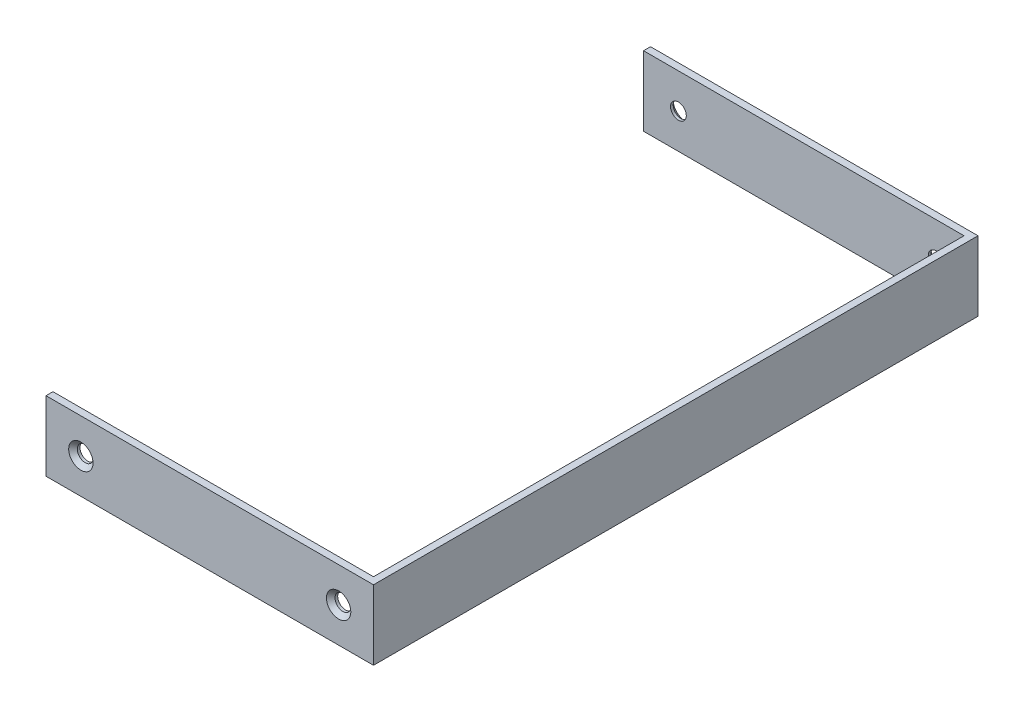
ISO-10303-21;
HEADER;
FILE_DESCRIPTION(('STEP AP214'),'2;1');
FILE_NAME('part.step','',(''),(''),'','','');
FILE_SCHEMA(('AUTOMOTIVE_DESIGN { 1 0 10303 214 1 1 1 1 }'));
ENDSEC;
DATA;
#1=APPLICATION_CONTEXT('core data for automotive mechanical design processes');
#2=APPLICATION_PROTOCOL_DEFINITION('international standard','automotive_design',2000,#1);
#3=PRODUCT_CONTEXT('',#1,'mechanical');
#4=PRODUCT('Part','Part','',(#3));
#5=PRODUCT_RELATED_PRODUCT_CATEGORY('part','',(#4));
#6=PRODUCT_DEFINITION_FORMATION('','',#4);
#7=PRODUCT_DEFINITION_CONTEXT('part definition',#1,'design');
#8=PRODUCT_DEFINITION('design','',#6,#7);
#9=PRODUCT_DEFINITION_SHAPE('','',#8);
#10=(LENGTH_UNIT() NAMED_UNIT(*) SI_UNIT(.MILLI.,.METRE.));
#11=(NAMED_UNIT(*) PLANE_ANGLE_UNIT() SI_UNIT($,.RADIAN.));
#12=(NAMED_UNIT(*) SI_UNIT($,.STERADIAN.) SOLID_ANGLE_UNIT());
#13=UNCERTAINTY_MEASURE_WITH_UNIT(LENGTH_MEASURE(1.E-05),#10,'distance_accuracy_value','');
#14=(GEOMETRIC_REPRESENTATION_CONTEXT(3) GLOBAL_UNCERTAINTY_ASSIGNED_CONTEXT((#13)) GLOBAL_UNIT_ASSIGNED_CONTEXT((#10,
#11,#12)) REPRESENTATION_CONTEXT('',''));
#15=CARTESIAN_POINT('',(0.,0.,0.));
#16=DIRECTION('',(0.,0.,1.));
#17=DIRECTION('',(1.,0.,0.));
#18=AXIS2_PLACEMENT_3D('',#15,#16,#17);
#19=CARTESIAN_POINT('',(-44.7153411,9.52500000000001,82.5383333143333));
#20=DIRECTION('',(1.,0.,0.));
#21=DIRECTION('',(0.,0.,-1.));
#22=AXIS2_PLACEMENT_3D('',#19,#20,#21);
#23=PLANE('',#22);
#24=DIRECTION('',(0.,0.,-1.));
#25=VECTOR('',#24,1.);
#26=CARTESIAN_POINT('',(-44.7153411,9.52500000000001,82.5383333143333));
#27=LINE('',#26,#25);
#28=CARTESIAN_POINT('',(-44.7153411,9.52500000000001,82.5383333143333));
#29=VERTEX_POINT('',#28);
#30=CARTESIAN_POINT('',(-44.7153411,9.52500000000001,80.6333333143333));
#31=VERTEX_POINT('',#30);
#32=EDGE_CURVE('E48',#29,#31,#27,.T.);
#33=ORIENTED_EDGE('',*,*,#32,.T.);
#34=DIRECTION('',(0.,-1.,0.));
#35=VECTOR('',#34,1.);
#36=CARTESIAN_POINT('',(-44.7153411,9.52500000000001,80.6333333143333));
#37=LINE('',#36,#35);
#38=CARTESIAN_POINT('',(-44.7153411,-9.52500000000001,80.6333333143333));
#39=VERTEX_POINT('',#38);
#40=EDGE_CURVE('E181',#31,#39,#37,.T.);
#41=ORIENTED_EDGE('',*,*,#40,.T.);
#42=DIRECTION('',(0.,0.,-1.));
#43=VECTOR('',#42,1.);
#44=CARTESIAN_POINT('',(-44.7153411,-9.52500000000001,82.5383333143333));
#45=LINE('',#44,#43);
#46=CARTESIAN_POINT('',(-44.7153411,-9.52500000000001,82.5383333143333));
#47=VERTEX_POINT('',#46);
#48=EDGE_CURVE('E134',#47,#39,#45,.T.);
#49=ORIENTED_EDGE('',*,*,#48,.F.);
#50=DIRECTION('',(0.,-1.,0.));
#51=VECTOR('',#50,1.);
#52=CARTESIAN_POINT('',(-44.7153411,9.52500000000001,82.5383333143333));
#53=LINE('',#52,#51);
#54=EDGE_CURVE('E191',#29,#47,#53,.T.);
#55=ORIENTED_EDGE('',*,*,#54,.F.);
#56=EDGE_LOOP('',(#33,#41,#49,#55));
#57=FACE_BOUND('',#56,.T.);
#58=ADVANCED_FACE('F39',(#57),#23,.F.);
#59=CARTESIAN_POINT('',(44.7153411,9.525,82.5383333143333));
#60=DIRECTION('',(-1.,0.,0.));
#61=DIRECTION('',(0.,0.,1.));
#62=AXIS2_PLACEMENT_3D('',#59,#60,#61);
#63=PLANE('',#62);
#64=DIRECTION('',(0.,1.,0.));
#65=VECTOR('',#64,1.);
#66=CARTESIAN_POINT('',(44.7153411,9.525,-82.5383333143333));
#67=LINE('',#66,#65);
#68=CARTESIAN_POINT('',(44.7153411,-9.525,-82.5383333143333));
#69=VERTEX_POINT('',#68);
#70=CARTESIAN_POINT('',(44.7153411,9.525,-82.5383333143333));
#71=VERTEX_POINT('',#70);
#72=EDGE_CURVE('E184',#69,#71,#67,.T.);
#73=ORIENTED_EDGE('',*,*,#72,.T.);
#74=DIRECTION('',(0.,0.,-1.));
#75=VECTOR('',#74,1.);
#76=CARTESIAN_POINT('',(44.7153411,9.525,82.5383333143333));
#77=LINE('',#76,#75);
#78=CARTESIAN_POINT('',(44.7153411,9.525,82.5383333143333));
#79=VERTEX_POINT('',#78);
#80=EDGE_CURVE('E11',#79,#71,#77,.T.);
#81=ORIENTED_EDGE('',*,*,#80,.F.);
#82=DIRECTION('',(0.,1.,0.));
#83=VECTOR('',#82,1.);
#84=CARTESIAN_POINT('',(44.7153411,9.525,82.5383333143333));
#85=LINE('',#84,#83);
#86=CARTESIAN_POINT('',(44.7153411,-9.525,82.5383333143333));
#87=VERTEX_POINT('',#86);
#88=EDGE_CURVE('E188',#87,#79,#85,.T.);
#89=ORIENTED_EDGE('',*,*,#88,.F.);
#90=DIRECTION('',(0.,0.,-1.));
#91=VECTOR('',#90,1.);
#92=CARTESIAN_POINT('',(44.7153411,-9.525,82.5383333143333));
#93=LINE('',#92,#91);
#94=EDGE_CURVE('E194',#87,#69,#93,.T.);
#95=ORIENTED_EDGE('',*,*,#94,.T.);
#96=EDGE_LOOP('',(#73,#81,#89,#95));
#97=FACE_BOUND('',#96,.T.);
#98=ADVANCED_FACE('F41',(#97),#63,.F.);
#99=CARTESIAN_POINT('',(44.7153411,9.525,82.5383333143333));
#100=DIRECTION('',(0.,-1.,0.));
#101=DIRECTION('',(1.,0.,0.));
#102=AXIS2_PLACEMENT_3D('',#99,#100,#101);
#103=PLANE('',#102);
#104=DIRECTION('',(0.,0.,1.));
#105=VECTOR('',#104,1.);
#106=CARTESIAN_POINT('',(42.8103411,9.52500000000001,80.6333333143333));
#107=LINE('',#106,#105);
#108=CARTESIAN_POINT('',(42.8103411,9.52500000000001,-80.6333333143333));
#109=VERTEX_POINT('',#108);
#110=CARTESIAN_POINT('',(42.8103411,9.52500000000001,80.6333333143333));
#111=VERTEX_POINT('',#110);
#112=EDGE_CURVE('E119',#109,#111,#107,.T.);
#113=ORIENTED_EDGE('',*,*,#112,.T.);
#114=DIRECTION('',(-1.,0.,0.));
#115=VECTOR('',#114,1.);
#116=CARTESIAN_POINT('',(-44.7153411,9.52500000000001,80.6333333143333));
#117=LINE('',#116,#115);
#118=EDGE_CURVE('E129',#111,#31,#117,.T.);
#119=ORIENTED_EDGE('',*,*,#118,.T.);
#120=ORIENTED_EDGE('',*,*,#32,.F.);
#121=DIRECTION('',(-1.,0.,0.));
#122=VECTOR('',#121,1.);
#123=CARTESIAN_POINT('',(44.7153411,9.525,82.5383333143333));
#124=LINE('',#123,#122);
#125=EDGE_CURVE('E92',#79,#29,#124,.T.);
#126=ORIENTED_EDGE('',*,*,#125,.F.);
#127=ORIENTED_EDGE('',*,*,#80,.T.);
#128=DIRECTION('',(-1.,0.,0.));
#129=VECTOR('',#128,1.);
#130=CARTESIAN_POINT('',(44.7153411,9.525,-82.5383333143333));
#131=LINE('',#130,#129);
#132=CARTESIAN_POINT('',(-44.7153411,9.52500000000001,-82.5383333143333));
#133=VERTEX_POINT('',#132);
#134=EDGE_CURVE('E132',#71,#133,#131,.T.);
#135=ORIENTED_EDGE('',*,*,#134,.T.);
#136=CARTESIAN_POINT('',(-44.7153411,9.52500000000001,-80.6333333143333));
#137=VERTEX_POINT('',#136);
#138=EDGE_CURVE('E126',#137,#133,#27,.T.);
#139=ORIENTED_EDGE('',*,*,#138,.F.);
#140=DIRECTION('',(1.,0.,0.));
#141=VECTOR('',#140,1.);
#142=CARTESIAN_POINT('',(-44.7153411,9.52500000000001,-80.6333333143333));
#143=LINE('',#142,#141);
#144=EDGE_CURVE('E113',#137,#109,#143,.T.);
#145=ORIENTED_EDGE('',*,*,#144,.T.);
#146=EDGE_LOOP('',(#113,#119,#120,#126,#127,#135,#139,#145));
#147=FACE_BOUND('',#146,.T.);
#148=ADVANCED_FACE('F131',(#147),#103,.F.);
#149=CARTESIAN_POINT('',(-44.7153411,-9.52500000000001,-80.6333333143333));
#150=VERTEX_POINT('',#149);
#151=CARTESIAN_POINT('',(-44.7153411,-9.52500000000001,-82.5383333143333));
#152=VERTEX_POINT('',#151);
#153=EDGE_CURVE('E128',#150,#152,#45,.T.);
#154=ORIENTED_EDGE('',*,*,#153,.F.);
#155=DIRECTION('',(0.,-1.,0.));
#156=VECTOR('',#155,1.);
#157=CARTESIAN_POINT('',(-44.7153411,9.52500000000001,-80.6333333143333));
#158=LINE('',#157,#156);
#159=EDGE_CURVE('E56',#137,#150,#158,.T.);
#160=ORIENTED_EDGE('',*,*,#159,.F.);
#161=ORIENTED_EDGE('',*,*,#138,.T.);
#162=DIRECTION('',(0.,-1.,0.));
#163=VECTOR('',#162,1.);
#164=CARTESIAN_POINT('',(-44.7153411,9.52500000000001,-82.5383333143333));
#165=LINE('',#164,#163);
#166=EDGE_CURVE('E198',#133,#152,#165,.T.);
#167=ORIENTED_EDGE('',*,*,#166,.T.);
#168=EDGE_LOOP('',(#154,#160,#161,#167));
#169=FACE_BOUND('',#168,.T.);
#170=ADVANCED_FACE('F124',(#169),#23,.F.);
#171=CARTESIAN_POINT('',(44.7153411,-9.525,82.5383333143333));
#172=DIRECTION('',(0.,1.,0.));
#173=DIRECTION('',(-1.,0.,0.));
#174=AXIS2_PLACEMENT_3D('',#171,#172,#173);
#175=PLANE('',#174);
#176=ORIENTED_EDGE('',*,*,#48,.T.);
#177=DIRECTION('',(-1.,0.,0.));
#178=VECTOR('',#177,1.);
#179=CARTESIAN_POINT('',(-44.7153411,-9.52500000000001,80.6333333143333));
#180=LINE('',#179,#178);
#181=CARTESIAN_POINT('',(42.8103411,-9.525,80.6333333143333));
#182=VERTEX_POINT('',#181);
#183=EDGE_CURVE('E120',#182,#39,#180,.T.);
#184=ORIENTED_EDGE('',*,*,#183,.F.);
#185=DIRECTION('',(0.,0.,1.));
#186=VECTOR('',#185,1.);
#187=CARTESIAN_POINT('',(42.8103411,-9.525,80.6333333143333));
#188=LINE('',#187,#186);
#189=CARTESIAN_POINT('',(42.8103411,-9.525,-80.6333333143333));
#190=VERTEX_POINT('',#189);
#191=EDGE_CURVE('E177',#190,#182,#188,.T.);
#192=ORIENTED_EDGE('',*,*,#191,.F.);
#193=DIRECTION('',(1.,0.,0.));
#194=VECTOR('',#193,1.);
#195=CARTESIAN_POINT('',(-44.7153411,-9.52500000000001,-80.6333333143333));
#196=LINE('',#195,#194);
#197=EDGE_CURVE('E171',#150,#190,#196,.T.);
#198=ORIENTED_EDGE('',*,*,#197,.F.);
#199=ORIENTED_EDGE('',*,*,#153,.T.);
#200=DIRECTION('',(1.,0.,0.));
#201=VECTOR('',#200,1.);
#202=CARTESIAN_POINT('',(44.7153411,-9.525,-82.5383333143333));
#203=LINE('',#202,#201);
#204=EDGE_CURVE('E85',#152,#69,#203,.T.);
#205=ORIENTED_EDGE('',*,*,#204,.T.);
#206=ORIENTED_EDGE('',*,*,#94,.F.);
#207=DIRECTION('',(1.,0.,0.));
#208=VECTOR('',#207,1.);
#209=CARTESIAN_POINT('',(44.7153411,-9.525,82.5383333143333));
#210=LINE('',#209,#208);
#211=EDGE_CURVE('E65',#47,#87,#210,.T.);
#212=ORIENTED_EDGE('',*,*,#211,.F.);
#213=EDGE_LOOP('',(#176,#184,#192,#198,#199,#205,#206,#212));
#214=FACE_BOUND('',#213,.T.);
#215=ADVANCED_FACE('F203',(#214),#175,.F.);
#216=CARTESIAN_POINT('',(0.,0.,82.5383333143333));
#217=DIRECTION('',(0.,0.,-1.));
#218=DIRECTION('',(-1.,0.,0.));
#219=AXIS2_PLACEMENT_3D('',#216,#217,#218);
#220=PLANE('',#219);
#221=CARTESIAN_POINT('',(-35.1903411,0.,82.5383333143333));
#222=DIRECTION('',(0.,0.,1.));
#223=DIRECTION('',(1.,0.,0.));
#224=AXIS2_PLACEMENT_3D('',#221,#222,#223);
#225=CIRCLE('',#224,3.3274);
#226=CARTESIAN_POINT('',(-31.8629411,0.,82.5383333143333));
#227=VERTEX_POINT('',#226);
#228=EDGE_CURVE('E382',#227,#227,#225,.T.);
#229=ORIENTED_EDGE('',*,*,#228,.F.);
#230=EDGE_LOOP('',(#229));
#231=FACE_BOUND('',#230,.T.);
#232=CARTESIAN_POINT('',(35.1903411,0.,82.5383333143333));
#233=DIRECTION('',(0.,0.,1.));
#234=DIRECTION('',(1.,0.,0.));
#235=AXIS2_PLACEMENT_3D('',#232,#233,#234);
#236=CIRCLE('',#235,3.3274);
#237=CARTESIAN_POINT('',(38.5177411,0.,82.5383333143333));
#238=VERTEX_POINT('',#237);
#239=EDGE_CURVE('E150',#238,#238,#236,.T.);
#240=ORIENTED_EDGE('',*,*,#239,.F.);
#241=EDGE_LOOP('',(#240));
#242=FACE_BOUND('',#241,.T.);
#243=ORIENTED_EDGE('',*,*,#88,.T.);
#244=ORIENTED_EDGE('',*,*,#125,.T.);
#245=ORIENTED_EDGE('',*,*,#54,.T.);
#246=ORIENTED_EDGE('',*,*,#211,.T.);
#247=EDGE_LOOP('',(#243,#244,#245,#246));
#248=FACE_BOUND('',#247,.T.);
#249=ADVANCED_FACE('F208',(#231,#242,#248),#220,.F.);
#250=CARTESIAN_POINT('',(0.,0.,-82.5383333143333));
#251=DIRECTION('',(0.,0.,-1.));
#252=DIRECTION('',(-1.,0.,0.));
#253=AXIS2_PLACEMENT_3D('',#250,#251,#252);
#254=PLANE('',#253);
#255=CARTESIAN_POINT('',(-35.1903411,0.,-82.5383333143333));
#256=DIRECTION('',(0.,0.,-1.));
#257=DIRECTION('',(-1.,0.,0.));
#258=AXIS2_PLACEMENT_3D('',#255,#256,#257);
#259=CIRCLE('',#258,3.3274);
#260=CARTESIAN_POINT('',(-38.5177411,0.,-82.5383333143333));
#261=VERTEX_POINT('',#260);
#262=EDGE_CURVE('E142',#261,#261,#259,.T.);
#263=ORIENTED_EDGE('',*,*,#262,.F.);
#264=EDGE_LOOP('',(#263));
#265=FACE_BOUND('',#264,.T.);
#266=CARTESIAN_POINT('',(35.1903411,0.,-82.5383333143333));
#267=DIRECTION('',(0.,0.,-1.));
#268=DIRECTION('',(-1.,0.,0.));
#269=AXIS2_PLACEMENT_3D('',#266,#267,#268);
#270=CIRCLE('',#269,3.3274);
#271=CARTESIAN_POINT('',(31.8629411,0.,-82.5383333143333));
#272=VERTEX_POINT('',#271);
#273=EDGE_CURVE('E163',#272,#272,#270,.T.);
#274=ORIENTED_EDGE('',*,*,#273,.F.);
#275=EDGE_LOOP('',(#274));
#276=FACE_BOUND('',#275,.T.);
#277=ORIENTED_EDGE('',*,*,#72,.F.);
#278=ORIENTED_EDGE('',*,*,#204,.F.);
#279=ORIENTED_EDGE('',*,*,#166,.F.);
#280=ORIENTED_EDGE('',*,*,#134,.F.);
#281=EDGE_LOOP('',(#277,#278,#279,#280));
#282=FACE_BOUND('',#281,.T.);
#283=ADVANCED_FACE('F206',(#265,#276,#282),#254,.T.);
#284=CARTESIAN_POINT('',(-44.7153411,9.52500000000001,80.6333333143333));
#285=DIRECTION('',(0.,0.,1.));
#286=DIRECTION('',(1.,0.,0.));
#287=AXIS2_PLACEMENT_3D('',#284,#285,#286);
#288=PLANE('',#287);
#289=CARTESIAN_POINT('',(-35.1903411,0.,80.6333333143333));
#290=DIRECTION('',(0.,0.,1.));
#291=DIRECTION('',(1.,0.,0.));
#292=AXIS2_PLACEMENT_3D('',#289,#290,#291);
#293=CIRCLE('',#292,2.15265);
#294=CARTESIAN_POINT('',(-33.0376911,0.,80.6333333143333));
#295=VERTEX_POINT('',#294);
#296=EDGE_CURVE('E43',#295,#295,#293,.T.);
#297=ORIENTED_EDGE('',*,*,#296,.T.);
#298=EDGE_LOOP('',(#297));
#299=FACE_BOUND('',#298,.T.);
#300=CARTESIAN_POINT('',(35.1903411,0.,80.6333333143333));
#301=DIRECTION('',(0.,0.,1.));
#302=DIRECTION('',(1.,0.,0.));
#303=AXIS2_PLACEMENT_3D('',#300,#301,#302);
#304=CIRCLE('',#303,2.15265);
#305=CARTESIAN_POINT('',(37.3429911,0.,80.6333333143333));
#306=VERTEX_POINT('',#305);
#307=EDGE_CURVE('E140',#306,#306,#304,.T.);
#308=ORIENTED_EDGE('',*,*,#307,.T.);
#309=EDGE_LOOP('',(#308));
#310=FACE_BOUND('',#309,.T.);
#311=ORIENTED_EDGE('',*,*,#183,.T.);
#312=ORIENTED_EDGE('',*,*,#40,.F.);
#313=ORIENTED_EDGE('',*,*,#118,.F.);
#314=DIRECTION('',(0.,-1.,0.));
#315=VECTOR('',#314,1.);
#316=CARTESIAN_POINT('',(42.8103411,9.52500000000001,80.6333333143333));
#317=LINE('',#316,#315);
#318=EDGE_CURVE('E185',#111,#182,#317,.T.);
#319=ORIENTED_EDGE('',*,*,#318,.T.);
#320=EDGE_LOOP('',(#311,#312,#313,#319));
#321=FACE_BOUND('',#320,.T.);
#322=ADVANCED_FACE('F215',(#299,#310,#321),#288,.F.);
#323=CARTESIAN_POINT('',(42.8103411,9.52500000000001,80.6333333143333));
#324=DIRECTION('',(1.,0.,0.));
#325=DIRECTION('',(0.,1.,0.));
#326=AXIS2_PLACEMENT_3D('',#323,#324,#325);
#327=PLANE('',#326);
#328=ORIENTED_EDGE('',*,*,#191,.T.);
#329=ORIENTED_EDGE('',*,*,#318,.F.);
#330=ORIENTED_EDGE('',*,*,#112,.F.);
#331=DIRECTION('',(0.,-1.,0.));
#332=VECTOR('',#331,1.);
#333=CARTESIAN_POINT('',(42.8103411,9.52500000000001,-80.6333333143333));
#334=LINE('',#333,#332);
#335=EDGE_CURVE('E115',#109,#190,#334,.T.);
#336=ORIENTED_EDGE('',*,*,#335,.T.);
#337=EDGE_LOOP('',(#328,#329,#330,#336));
#338=FACE_BOUND('',#337,.T.);
#339=ADVANCED_FACE('F217',(#338),#327,.F.);
#340=CARTESIAN_POINT('',(-44.7153411,9.52500000000001,-80.6333333143333));
#341=DIRECTION('',(0.,0.,-1.));
#342=DIRECTION('',(-1.,0.,0.));
#343=AXIS2_PLACEMENT_3D('',#340,#341,#342);
#344=PLANE('',#343);
#345=CARTESIAN_POINT('',(-35.1903411,0.,-80.6333333143333));
#346=DIRECTION('',(0.,0.,-1.));
#347=DIRECTION('',(-1.,0.,0.));
#348=AXIS2_PLACEMENT_3D('',#345,#346,#347);
#349=CIRCLE('',#348,2.15265);
#350=CARTESIAN_POINT('',(-37.3429911,0.,-80.6333333143333));
#351=VERTEX_POINT('',#350);
#352=EDGE_CURVE('E160',#351,#351,#349,.T.);
#353=ORIENTED_EDGE('',*,*,#352,.T.);
#354=EDGE_LOOP('',(#353));
#355=FACE_BOUND('',#354,.T.);
#356=CARTESIAN_POINT('',(35.1903411,0.,-80.6333333143333));
#357=DIRECTION('',(0.,0.,-1.));
#358=DIRECTION('',(-1.,0.,0.));
#359=AXIS2_PLACEMENT_3D('',#356,#357,#358);
#360=CIRCLE('',#359,2.15265);
#361=CARTESIAN_POINT('',(33.0376911,0.,-80.6333333143333));
#362=VERTEX_POINT('',#361);
#363=EDGE_CURVE('E169',#362,#362,#360,.T.);
#364=ORIENTED_EDGE('',*,*,#363,.T.);
#365=EDGE_LOOP('',(#364));
#366=FACE_BOUND('',#365,.T.);
#367=ORIENTED_EDGE('',*,*,#197,.T.);
#368=ORIENTED_EDGE('',*,*,#335,.F.);
#369=ORIENTED_EDGE('',*,*,#144,.F.);
#370=ORIENTED_EDGE('',*,*,#159,.T.);
#371=EDGE_LOOP('',(#367,#368,#369,#370));
#372=FACE_BOUND('',#371,.T.);
#373=ADVANCED_FACE('F114',(#355,#366,#372),#344,.F.);
#374=CARTESIAN_POINT('',(35.1903411,0.,-82.5383333143333));
#375=DIRECTION('',(0.,0.,-1.));
#376=DIRECTION('',(-1.,0.,0.));
#377=AXIS2_PLACEMENT_3D('',#374,#375,#376);
#378=CYLINDRICAL_SURFACE('',#377,2.15265);
#379=ORIENTED_EDGE('',*,*,#363,.F.);
#380=EDGE_LOOP('',(#379));
#381=FACE_BOUND('',#380,.T.);
#382=CARTESIAN_POINT('',(35.1903411,0.,-81.3635833143333));
#383=DIRECTION('',(0.,0.,-1.));
#384=DIRECTION('',(-1.,0.,0.));
#385=AXIS2_PLACEMENT_3D('',#382,#383,#384);
#386=CIRCLE('',#385,2.15265);
#387=CARTESIAN_POINT('',(33.0376911,0.,-81.3635833143333));
#388=VERTEX_POINT('',#387);
#389=EDGE_CURVE('E166',#388,#388,#386,.T.);
#390=ORIENTED_EDGE('',*,*,#389,.T.);
#391=EDGE_LOOP('',(#390));
#392=FACE_BOUND('',#391,.T.);
#393=ADVANCED_FACE('F225',(#381,#392),#378,.F.);
#394=CARTESIAN_POINT('',(35.1903411,0.,-82.5383333143333));
#395=DIRECTION('',(0.,0.,-1.));
#396=DIRECTION('',(-1.,0.,0.));
#397=AXIS2_PLACEMENT_3D('',#394,#395,#396);
#398=CONICAL_SURFACE('',#397,3.3274,0.785398163397448);
#399=ORIENTED_EDGE('',*,*,#389,.F.);
#400=EDGE_LOOP('',(#399));
#401=FACE_BOUND('',#400,.T.);
#402=ORIENTED_EDGE('',*,*,#273,.T.);
#403=EDGE_LOOP('',(#402));
#404=FACE_BOUND('',#403,.T.);
#405=ADVANCED_FACE('F306',(#401,#404),#398,.F.);
#406=CARTESIAN_POINT('',(-35.1903411,0.,-82.5383333143333));
#407=DIRECTION('',(0.,0.,-1.));
#408=DIRECTION('',(-1.,0.,0.));
#409=AXIS2_PLACEMENT_3D('',#406,#407,#408);
#410=CYLINDRICAL_SURFACE('',#409,2.15265);
#411=ORIENTED_EDGE('',*,*,#352,.F.);
#412=EDGE_LOOP('',(#411));
#413=FACE_BOUND('',#412,.T.);
#414=CARTESIAN_POINT('',(-35.1903411,0.,-81.3635833143333));
#415=DIRECTION('',(0.,0.,-1.));
#416=DIRECTION('',(-1.,0.,0.));
#417=AXIS2_PLACEMENT_3D('',#414,#415,#416);
#418=CIRCLE('',#417,2.15265);
#419=CARTESIAN_POINT('',(-37.3429911,0.,-81.3635833143333));
#420=VERTEX_POINT('',#419);
#421=EDGE_CURVE('E147',#420,#420,#418,.T.);
#422=ORIENTED_EDGE('',*,*,#421,.T.);
#423=EDGE_LOOP('',(#422));
#424=FACE_BOUND('',#423,.T.);
#425=ADVANCED_FACE('F316',(#413,#424),#410,.F.);
#426=CARTESIAN_POINT('',(-35.1903411,0.,-82.5383333143333));
#427=DIRECTION('',(0.,0.,-1.));
#428=DIRECTION('',(-1.,0.,0.));
#429=AXIS2_PLACEMENT_3D('',#426,#427,#428);
#430=CONICAL_SURFACE('',#429,3.3274,0.785398163397448);
#431=ORIENTED_EDGE('',*,*,#421,.F.);
#432=EDGE_LOOP('',(#431));
#433=FACE_BOUND('',#432,.T.);
#434=ORIENTED_EDGE('',*,*,#262,.T.);
#435=EDGE_LOOP('',(#434));
#436=FACE_BOUND('',#435,.T.);
#437=ADVANCED_FACE('F326',(#433,#436),#430,.F.);
#438=CARTESIAN_POINT('',(35.1903411,0.,82.5383333143333));
#439=DIRECTION('',(0.,0.,1.));
#440=DIRECTION('',(1.,0.,0.));
#441=AXIS2_PLACEMENT_3D('',#438,#439,#440);
#442=CYLINDRICAL_SURFACE('',#441,2.15265);
#443=CARTESIAN_POINT('',(35.1903411,0.,81.3635833143333));
#444=DIRECTION('',(0.,0.,1.));
#445=DIRECTION('',(1.,0.,0.));
#446=AXIS2_PLACEMENT_3D('',#443,#444,#445);
#447=CIRCLE('',#446,2.15265);
#448=CARTESIAN_POINT('',(37.3429911,0.,81.3635833143333));
#449=VERTEX_POINT('',#448);
#450=EDGE_CURVE('E143',#449,#449,#447,.T.);
#451=ORIENTED_EDGE('',*,*,#450,.T.);
#452=EDGE_LOOP('',(#451));
#453=FACE_BOUND('',#452,.T.);
#454=ORIENTED_EDGE('',*,*,#307,.F.);
#455=EDGE_LOOP('',(#454));
#456=FACE_BOUND('',#455,.T.);
#457=ADVANCED_FACE('F335',(#453,#456),#442,.F.);
#458=CARTESIAN_POINT('',(35.1903411,0.,82.5383333143333));
#459=DIRECTION('',(0.,0.,1.));
#460=DIRECTION('',(1.,0.,0.));
#461=AXIS2_PLACEMENT_3D('',#458,#459,#460);
#462=CONICAL_SURFACE('',#461,3.3274,0.785398163397448);
#463=ORIENTED_EDGE('',*,*,#450,.F.);
#464=EDGE_LOOP('',(#463));
#465=FACE_BOUND('',#464,.T.);
#466=ORIENTED_EDGE('',*,*,#239,.T.);
#467=EDGE_LOOP('',(#466));
#468=FACE_BOUND('',#467,.T.);
#469=ADVANCED_FACE('F344',(#465,#468),#462,.F.);
#470=CARTESIAN_POINT('',(-35.1903411,0.,82.5383333143333));
#471=DIRECTION('',(0.,0.,1.));
#472=DIRECTION('',(1.,0.,0.));
#473=AXIS2_PLACEMENT_3D('',#470,#471,#472);
#474=CYLINDRICAL_SURFACE('',#473,2.15265);
#475=CARTESIAN_POINT('',(-35.1903411,0.,81.3635833143333));
#476=DIRECTION('',(0.,0.,1.));
#477=DIRECTION('',(1.,0.,0.));
#478=AXIS2_PLACEMENT_3D('',#475,#476,#477);
#479=CIRCLE('',#478,2.15265);
#480=CARTESIAN_POINT('',(-33.0376911,0.,81.3635833143333));
#481=VERTEX_POINT('',#480);
#482=EDGE_CURVE('E379',#481,#481,#479,.T.);
#483=ORIENTED_EDGE('',*,*,#482,.T.);
#484=EDGE_LOOP('',(#483));
#485=FACE_BOUND('',#484,.T.);
#486=ORIENTED_EDGE('',*,*,#296,.F.);
#487=EDGE_LOOP('',(#486));
#488=FACE_BOUND('',#487,.T.);
#489=ADVANCED_FACE('F353',(#485,#488),#474,.F.);
#490=CARTESIAN_POINT('',(-35.1903411,0.,82.5383333143333));
#491=DIRECTION('',(0.,0.,1.));
#492=DIRECTION('',(1.,0.,0.));
#493=AXIS2_PLACEMENT_3D('',#490,#491,#492);
#494=CONICAL_SURFACE('',#493,3.3274,0.785398163397448);
#495=ORIENTED_EDGE('',*,*,#482,.F.);
#496=EDGE_LOOP('',(#495));
#497=FACE_BOUND('',#496,.T.);
#498=ORIENTED_EDGE('',*,*,#228,.T.);
#499=EDGE_LOOP('',(#498));
#500=FACE_BOUND('',#499,.T.);
#501=ADVANCED_FACE('F363',(#497,#500),#494,.F.);
#502=CLOSED_SHELL('',(#58,#98,#148,#170,#215,#249,#283,#322,#339,#373,#393,#405,#425,#437,#457,
#469,#489,#501));
#503=MANIFOLD_SOLID_BREP('B2',#502);
#504=ADVANCED_BREP_SHAPE_REPRESENTATION('',(#18,#503),#14);
#505=SHAPE_DEFINITION_REPRESENTATION(#9,#504);
ENDSEC;
END-ISO-10303-21;
